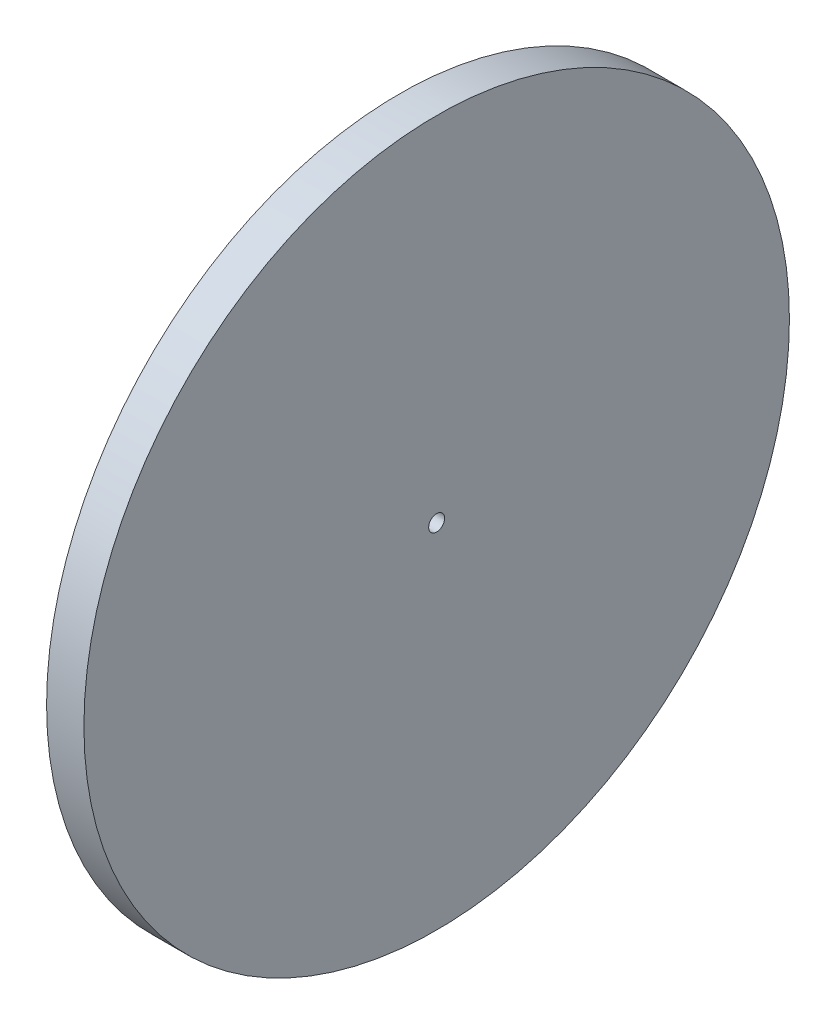
ISO-10303-21;
HEADER;
FILE_DESCRIPTION(('STEP AP214'),'2;1');
FILE_NAME('part.step','',(''),(''),'','','');
FILE_SCHEMA(('AUTOMOTIVE_DESIGN { 1 0 10303 214 1 1 1 1 }'));
ENDSEC;
DATA;
#1=APPLICATION_CONTEXT('core data for automotive mechanical design processes');
#2=APPLICATION_PROTOCOL_DEFINITION('international standard','automotive_design',2000,#1);
#3=PRODUCT_CONTEXT('',#1,'mechanical');
#4=PRODUCT('Part','Part','',(#3));
#5=PRODUCT_RELATED_PRODUCT_CATEGORY('part','',(#4));
#6=PRODUCT_DEFINITION_FORMATION('','',#4);
#7=PRODUCT_DEFINITION_CONTEXT('part definition',#1,'design');
#8=PRODUCT_DEFINITION('design','',#6,#7);
#9=PRODUCT_DEFINITION_SHAPE('','',#8);
#10=(LENGTH_UNIT() NAMED_UNIT(*) SI_UNIT(.MILLI.,.METRE.));
#11=(NAMED_UNIT(*) PLANE_ANGLE_UNIT() SI_UNIT($,.RADIAN.));
#12=(NAMED_UNIT(*) SI_UNIT($,.STERADIAN.) SOLID_ANGLE_UNIT());
#13=UNCERTAINTY_MEASURE_WITH_UNIT(LENGTH_MEASURE(1.E-05),#10,'distance_accuracy_value','');
#14=(GEOMETRIC_REPRESENTATION_CONTEXT(3) GLOBAL_UNCERTAINTY_ASSIGNED_CONTEXT((#13)) GLOBAL_UNIT_ASSIGNED_CONTEXT((#10,
#11,#12)) REPRESENTATION_CONTEXT('',''));
#15=CARTESIAN_POINT('',(0.,0.,0.));
#16=DIRECTION('',(0.,0.,1.));
#17=DIRECTION('',(1.,0.,0.));
#18=AXIS2_PLACEMENT_3D('',#15,#16,#17);
#19=CARTESIAN_POINT('',(3.175,2.663866039953,1.77591069330199));
#20=DIRECTION('',(1.,0.,0.));
#21=DIRECTION('',(0.,0.,-1.));
#22=AXIS2_PLACEMENT_3D('',#19,#20,#21);
#23=PLANE('',#22);
#24=CARTESIAN_POINT('',(3.175,2.663866039953,1.77591069330199));
#25=DIRECTION('',(1.,0.,0.));
#26=DIRECTION('',(0.,0.,-1.));
#27=AXIS2_PLACEMENT_3D('',#24,#25,#26);
#28=CIRCLE('',#27,30.);
#29=CARTESIAN_POINT('',(3.175,2.663866039953,-28.224089306698));
#30=VERTEX_POINT('',#29);
#31=EDGE_CURVE('E10',#30,#30,#28,.T.);
#32=ORIENTED_EDGE('',*,*,#31,.T.);
#33=EDGE_LOOP('',(#32));
#34=FACE_BOUND('',#33,.T.);
#35=CARTESIAN_POINT('',(3.175,2.663866039953,1.77591069330199));
#36=DIRECTION('',(1.,0.,0.));
#37=DIRECTION('',(0.,0.,-1.));
#38=AXIS2_PLACEMENT_3D('',#35,#36,#37);
#39=CIRCLE('',#38,0.678042933287909);
#40=CARTESIAN_POINT('',(3.175,2.663866039953,1.09786776001408));
#41=VERTEX_POINT('',#40);
#42=EDGE_CURVE('E40',#41,#41,#39,.T.);
#43=ORIENTED_EDGE('',*,*,#42,.F.);
#44=EDGE_LOOP('',(#43));
#45=FACE_BOUND('',#44,.T.);
#46=ADVANCED_FACE('F29',(#34,#45),#23,.T.);
#47=CARTESIAN_POINT('',(0.,2.663866039953,1.77591069330199));
#48=DIRECTION('',(1.,0.,0.));
#49=DIRECTION('',(0.,0.,-1.));
#50=AXIS2_PLACEMENT_3D('',#47,#48,#49);
#51=PLANE('',#50);
#52=CARTESIAN_POINT('',(0.,2.663866039953,1.77591069330199));
#53=DIRECTION('',(1.,0.,0.));
#54=DIRECTION('',(0.,0.,-1.));
#55=AXIS2_PLACEMENT_3D('',#52,#53,#54);
#56=CIRCLE('',#55,30.);
#57=CARTESIAN_POINT('',(0.,2.663866039953,-28.224089306698));
#58=VERTEX_POINT('',#57);
#59=EDGE_CURVE('E33',#58,#58,#56,.T.);
#60=ORIENTED_EDGE('',*,*,#59,.F.);
#61=EDGE_LOOP('',(#60));
#62=FACE_BOUND('',#61,.T.);
#63=CARTESIAN_POINT('',(0.,2.663866039953,1.77591069330199));
#64=DIRECTION('',(1.,0.,0.));
#65=DIRECTION('',(0.,0.,-1.));
#66=AXIS2_PLACEMENT_3D('',#63,#64,#65);
#67=CIRCLE('',#66,0.678042933287909);
#68=CARTESIAN_POINT('',(0.,2.663866039953,1.09786776001408));
#69=VERTEX_POINT('',#68);
#70=EDGE_CURVE('E42',#69,#69,#67,.T.);
#71=ORIENTED_EDGE('',*,*,#70,.T.);
#72=EDGE_LOOP('',(#71));
#73=FACE_BOUND('',#72,.T.);
#74=ADVANCED_FACE('F52',(#62,#73),#51,.F.);
#75=CARTESIAN_POINT('',(3.175,2.663866039953,1.77591069330199));
#76=DIRECTION('',(-1.,0.,0.));
#77=DIRECTION('',(0.,0.,1.));
#78=AXIS2_PLACEMENT_3D('',#75,#76,#77);
#79=CYLINDRICAL_SURFACE('',#78,30.);
#80=ORIENTED_EDGE('',*,*,#31,.F.);
#81=EDGE_LOOP('',(#80));
#82=FACE_BOUND('',#81,.T.);
#83=ORIENTED_EDGE('',*,*,#59,.T.);
#84=EDGE_LOOP('',(#83));
#85=FACE_BOUND('',#84,.T.);
#86=ADVANCED_FACE('F31',(#82,#85),#79,.T.);
#87=CARTESIAN_POINT('',(3.175,2.663866039953,1.77591069330199));
#88=DIRECTION('',(-1.,0.,0.));
#89=DIRECTION('',(0.,0.,1.));
#90=AXIS2_PLACEMENT_3D('',#87,#88,#89);
#91=CYLINDRICAL_SURFACE('',#90,0.678042933287909);
#92=ORIENTED_EDGE('',*,*,#42,.T.);
#93=EDGE_LOOP('',(#92));
#94=FACE_BOUND('',#93,.T.);
#95=ORIENTED_EDGE('',*,*,#70,.F.);
#96=EDGE_LOOP('',(#95));
#97=FACE_BOUND('',#96,.T.);
#98=ADVANCED_FACE('F48',(#94,#97),#91,.F.);
#99=CLOSED_SHELL('',(#46,#74,#86,#98));
#100=MANIFOLD_SOLID_BREP('B2',#99);
#101=ADVANCED_BREP_SHAPE_REPRESENTATION('',(#18,#100),#14);
#102=SHAPE_DEFINITION_REPRESENTATION(#9,#101);
ENDSEC;
END-ISO-10303-21;
